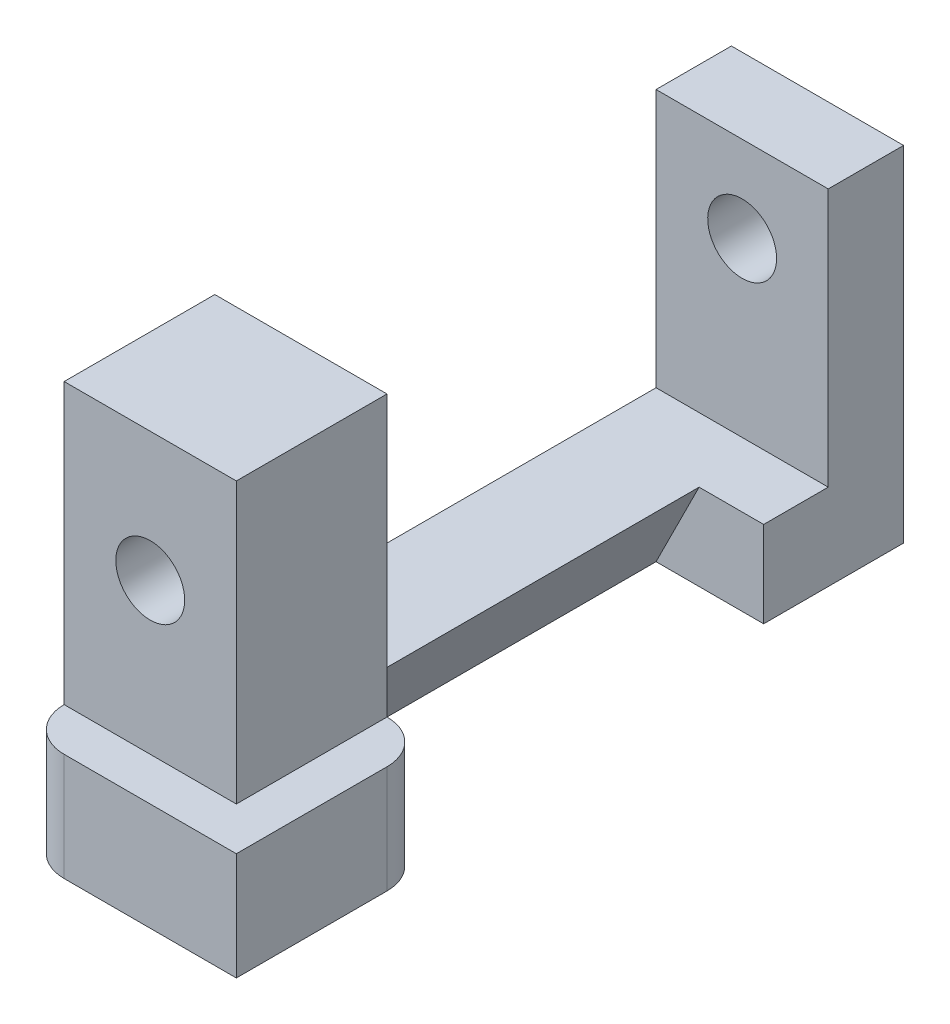
ISO-10303-21;
HEADER;
FILE_DESCRIPTION(('STEP AP214'),'2;1');
FILE_NAME('part.step','',(''),(''),'','','');
FILE_SCHEMA(('AUTOMOTIVE_DESIGN { 1 0 10303 214 1 1 1 1 }'));
ENDSEC;
DATA;
#1=APPLICATION_CONTEXT('core data for automotive mechanical design processes');
#2=APPLICATION_PROTOCOL_DEFINITION('international standard','automotive_design',2000,#1);
#3=PRODUCT_CONTEXT('',#1,'mechanical');
#4=PRODUCT('Part','Part','',(#3));
#5=PRODUCT_RELATED_PRODUCT_CATEGORY('part','',(#4));
#6=PRODUCT_DEFINITION_FORMATION('','',#4);
#7=PRODUCT_DEFINITION_CONTEXT('part definition',#1,'design');
#8=PRODUCT_DEFINITION('design','',#6,#7);
#9=PRODUCT_DEFINITION_SHAPE('','',#8);
#10=(LENGTH_UNIT() NAMED_UNIT(*) SI_UNIT(.MILLI.,.METRE.));
#11=(NAMED_UNIT(*) PLANE_ANGLE_UNIT() SI_UNIT($,.RADIAN.));
#12=(NAMED_UNIT(*) SI_UNIT($,.STERADIAN.) SOLID_ANGLE_UNIT());
#13=UNCERTAINTY_MEASURE_WITH_UNIT(LENGTH_MEASURE(1.E-05),#10,'distance_accuracy_value','');
#14=(GEOMETRIC_REPRESENTATION_CONTEXT(3) GLOBAL_UNCERTAINTY_ASSIGNED_CONTEXT((#13)) GLOBAL_UNIT_ASSIGNED_CONTEXT((#10,
#11,#12)) REPRESENTATION_CONTEXT('',''));
#15=CARTESIAN_POINT('',(0.,0.,0.));
#16=DIRECTION('',(0.,0.,1.));
#17=DIRECTION('',(1.,0.,0.));
#18=AXIS2_PLACEMENT_3D('',#15,#16,#17);
#19=CARTESIAN_POINT('',(-8.,18.,31.));
#20=DIRECTION('',(0.,0.,1.));
#21=DIRECTION('',(0.,-1.,0.));
#22=AXIS2_PLACEMENT_3D('',#19,#20,#21);
#23=PLANE('',#22);
#24=CARTESIAN_POINT('',(-12.,12.,31.));
#25=DIRECTION('',(0.,0.,1.));
#26=DIRECTION('',(1.,0.,0.));
#27=AXIS2_PLACEMENT_3D('',#24,#25,#26);
#28=CIRCLE('',#27,1.6);
#29=CARTESIAN_POINT('',(-10.4,12.,31.));
#30=VERTEX_POINT('',#29);
#31=EDGE_CURVE('E162',#30,#30,#28,.T.);
#32=ORIENTED_EDGE('',*,*,#31,.F.);
#33=EDGE_LOOP('',(#32));
#34=FACE_BOUND('',#33,.T.);
#35=DIRECTION('',(0.,-1.,0.));
#36=VECTOR('',#35,1.);
#37=CARTESIAN_POINT('',(-16.,18.,31.));
#38=LINE('',#37,#36);
#39=CARTESIAN_POINT('',(-16.,18.,31.));
#40=VERTEX_POINT('',#39);
#41=CARTESIAN_POINT('',(-16.,5.,31.));
#42=VERTEX_POINT('',#41);
#43=EDGE_CURVE('E255',#40,#42,#38,.T.);
#44=ORIENTED_EDGE('',*,*,#43,.T.);
#45=DIRECTION('',(1.,0.,0.));
#46=VECTOR('',#45,1.);
#47=CARTESIAN_POINT('',(-16.,5.,31.));
#48=LINE('',#47,#46);
#49=CARTESIAN_POINT('',(-8.,5.,31.));
#50=VERTEX_POINT('',#49);
#51=EDGE_CURVE('E183',#42,#50,#48,.T.);
#52=ORIENTED_EDGE('',*,*,#51,.T.);
#53=DIRECTION('',(0.,1.,0.));
#54=VECTOR('',#53,1.);
#55=CARTESIAN_POINT('',(-8.,18.,31.));
#56=LINE('',#55,#54);
#57=CARTESIAN_POINT('',(-8.,18.,31.));
#58=VERTEX_POINT('',#57);
#59=EDGE_CURVE('E245',#50,#58,#56,.T.);
#60=ORIENTED_EDGE('',*,*,#59,.T.);
#61=DIRECTION('',(1.,0.,0.));
#62=VECTOR('',#61,1.);
#63=CARTESIAN_POINT('',(-8.,18.,31.));
#64=LINE('',#63,#62);
#65=EDGE_CURVE('E52',#40,#58,#64,.T.);
#66=ORIENTED_EDGE('',*,*,#65,.F.);
#67=EDGE_LOOP('',(#44,#52,#60,#66));
#68=FACE_BOUND('',#67,.T.);
#69=ADVANCED_FACE('F44',(#34,#68),#23,.T.);
#70=CARTESIAN_POINT('',(-8.,0.,0.));
#71=DIRECTION('',(1.,0.,0.));
#72=DIRECTION('',(0.,0.,-1.));
#73=AXIS2_PLACEMENT_3D('',#70,#71,#72);
#74=PLANE('',#73);
#75=ORIENTED_EDGE('',*,*,#59,.F.);
#76=DIRECTION('',(0.,0.,-1.));
#77=VECTOR('',#76,1.);
#78=CARTESIAN_POINT('',(-8.,5.,31.));
#79=LINE('',#78,#77);
#80=CARTESIAN_POINT('',(-8.,5.,24.));
#81=VERTEX_POINT('',#80);
#82=EDGE_CURVE('E187',#50,#81,#79,.T.);
#83=ORIENTED_EDGE('',*,*,#82,.T.);
#84=DIRECTION('',(0.,-1.,0.));
#85=VECTOR('',#84,1.);
#86=CARTESIAN_POINT('',(-8.,4.,24.));
#87=LINE('',#86,#85);
#88=CARTESIAN_POINT('',(-8.,18.,24.));
#89=VERTEX_POINT('',#88);
#90=EDGE_CURVE('E239',#89,#81,#87,.T.);
#91=ORIENTED_EDGE('',*,*,#90,.F.);
#92=DIRECTION('',(0.,0.,-1.));
#93=VECTOR('',#92,1.);
#94=CARTESIAN_POINT('',(-8.,18.,24.));
#95=LINE('',#94,#93);
#96=EDGE_CURVE('E242',#58,#89,#95,.T.);
#97=ORIENTED_EDGE('',*,*,#96,.F.);
#98=EDGE_LOOP('',(#75,#83,#91,#97));
#99=FACE_BOUND('',#98,.T.);
#100=ADVANCED_FACE('F332',(#99),#74,.T.);
#101=CARTESIAN_POINT('',(-8.,16.,3.5));
#102=DIRECTION('',(0.,0.,1.));
#103=DIRECTION('',(0.,-1.,0.));
#104=AXIS2_PLACEMENT_3D('',#101,#102,#103);
#105=PLANE('',#104);
#106=CARTESIAN_POINT('',(-12.,12.,3.5));
#107=DIRECTION('',(0.,0.,1.));
#108=DIRECTION('',(0.,-1.,0.));
#109=AXIS2_PLACEMENT_3D('',#106,#107,#108);
#110=CIRCLE('',#109,1.6);
#111=CARTESIAN_POINT('',(-12.,10.4,3.5));
#112=VERTEX_POINT('',#111);
#113=EDGE_CURVE('E176',#112,#112,#110,.T.);
#114=ORIENTED_EDGE('',*,*,#113,.F.);
#115=EDGE_LOOP('',(#114));
#116=FACE_BOUND('',#115,.T.);
#117=DIRECTION('',(-1.,0.,0.));
#118=VECTOR('',#117,1.);
#119=CARTESIAN_POINT('',(-8.,4.,3.5));
#120=LINE('',#119,#118);
#121=CARTESIAN_POINT('',(-8.,4.,3.5));
#122=VERTEX_POINT('',#121);
#123=CARTESIAN_POINT('',(-16.,4.,3.5));
#124=VERTEX_POINT('',#123);
#125=EDGE_CURVE('E277',#122,#124,#120,.T.);
#126=ORIENTED_EDGE('',*,*,#125,.F.);
#127=DIRECTION('',(0.,1.,0.));
#128=VECTOR('',#127,1.);
#129=CARTESIAN_POINT('',(-8.,16.,3.5));
#130=LINE('',#129,#128);
#131=CARTESIAN_POINT('',(-8.,16.,3.5));
#132=VERTEX_POINT('',#131);
#133=EDGE_CURVE('E235',#122,#132,#130,.T.);
#134=ORIENTED_EDGE('',*,*,#133,.T.);
#135=DIRECTION('',(1.,0.,0.));
#136=VECTOR('',#135,1.);
#137=CARTESIAN_POINT('',(-8.,16.,3.5));
#138=LINE('',#137,#136);
#139=CARTESIAN_POINT('',(-16.,16.,3.5));
#140=VERTEX_POINT('',#139);
#141=EDGE_CURVE('E288',#140,#132,#138,.T.);
#142=ORIENTED_EDGE('',*,*,#141,.F.);
#143=DIRECTION('',(0.,-1.,0.));
#144=VECTOR('',#143,1.);
#145=CARTESIAN_POINT('',(-16.,16.,3.5));
#146=LINE('',#145,#144);
#147=EDGE_CURVE('E267',#140,#124,#146,.T.);
#148=ORIENTED_EDGE('',*,*,#147,.T.);
#149=EDGE_LOOP('',(#126,#134,#142,#148));
#150=FACE_BOUND('',#149,.T.);
#151=ADVANCED_FACE('F345',(#116,#150),#105,.T.);
#152=CARTESIAN_POINT('',(-13.,0.,30.4031242374328));
#153=DIRECTION('',(-0.894427190999916,0.447213595499958,0.));
#154=DIRECTION('',(-0.447213595499958,-0.894427190999916,0.));
#155=AXIS2_PLACEMENT_3D('',#152,#153,#154);
#156=PLANE('',#155);
#157=DIRECTION('',(-0.447213595499958,-0.894427190999916,0.));
#158=VECTOR('',#157,1.);
#159=CARTESIAN_POINT('',(-11.,4.,6.5));
#160=LINE('',#159,#158);
#161=CARTESIAN_POINT('',(-11.,4.,6.5));
#162=VERTEX_POINT('',#161);
#163=CARTESIAN_POINT('',(-13.,0.,6.5));
#164=VERTEX_POINT('',#163);
#165=EDGE_CURVE('E59',#162,#164,#160,.T.);
#166=ORIENTED_EDGE('',*,*,#165,.F.);
#167=DIRECTION('',(0.,0.,-1.));
#168=VECTOR('',#167,1.);
#169=CARTESIAN_POINT('',(-11.,4.,30.4031242374328));
#170=LINE('',#169,#168);
#171=CARTESIAN_POINT('',(-11.,4.,24.));
#172=VERTEX_POINT('',#171);
#173=EDGE_CURVE('E250',#172,#162,#170,.T.);
#174=ORIENTED_EDGE('',*,*,#173,.F.);
#175=DIRECTION('',(-0.447213595499958,-0.894427190999916,0.));
#176=VECTOR('',#175,1.);
#177=CARTESIAN_POINT('',(-13.,0.,24.));
#178=LINE('',#177,#176);
#179=CARTESIAN_POINT('',(-13.,0.,24.));
#180=VERTEX_POINT('',#179);
#181=EDGE_CURVE('E247',#172,#180,#178,.T.);
#182=ORIENTED_EDGE('',*,*,#181,.T.);
#183=DIRECTION('',(0.,0.,-1.));
#184=VECTOR('',#183,1.);
#185=CARTESIAN_POINT('',(-13.,0.,30.4031242374328));
#186=LINE('',#185,#184);
#187=EDGE_CURVE('E64',#180,#164,#186,.T.);
#188=ORIENTED_EDGE('',*,*,#187,.T.);
#189=EDGE_LOOP('',(#166,#174,#182,#188));
#190=FACE_BOUND('',#189,.T.);
#191=ADVANCED_FACE('F320',(#190),#156,.F.);
#192=CARTESIAN_POINT('',(-8.,0.,31.));
#193=DIRECTION('',(0.,-1.,0.));
#194=DIRECTION('',(0.,0.,-1.));
#195=AXIS2_PLACEMENT_3D('',#192,#193,#194);
#196=PLANE('',#195);
#197=CARTESIAN_POINT('',(-10.285,0.,29.));
#198=DIRECTION('',(0.,-1.,0.));
#199=DIRECTION('',(0.,0.,-1.));
#200=AXIS2_PLACEMENT_3D('',#197,#198,#199);
#201=CIRCLE('',#200,1.5);
#202=CARTESIAN_POINT('',(-10.285,0.,27.5));
#203=VERTEX_POINT('',#202);
#204=EDGE_CURVE('E163',#203,#203,#201,.T.);
#205=ORIENTED_EDGE('',*,*,#204,.F.);
#206=EDGE_LOOP('',(#205));
#207=FACE_BOUND('',#206,.T.);
#208=DIRECTION('',(0.,0.,1.));
#209=VECTOR('',#208,1.);
#210=CARTESIAN_POINT('',(-8.,0.,31.));
#211=LINE('',#210,#209);
#212=CARTESIAN_POINT('',(-8.,0.,0.));
#213=VERTEX_POINT('',#212);
#214=CARTESIAN_POINT('',(-8.,0.,6.5));
#215=VERTEX_POINT('',#214);
#216=EDGE_CURVE('E237',#213,#215,#211,.T.);
#217=ORIENTED_EDGE('',*,*,#216,.T.);
#218=DIRECTION('',(1.,0.,0.));
#219=VECTOR('',#218,1.);
#220=CARTESIAN_POINT('',(-13.,0.,6.5));
#221=LINE('',#220,#219);
#222=EDGE_CURVE('E224',#164,#215,#221,.T.);
#223=ORIENTED_EDGE('',*,*,#222,.F.);
#224=ORIENTED_EDGE('',*,*,#187,.F.);
#225=DIRECTION('',(-1.,0.,0.));
#226=VECTOR('',#225,1.);
#227=CARTESIAN_POINT('',(-8.,0.,24.));
#228=LINE('',#227,#226);
#229=CARTESIAN_POINT('',(-8.,0.,24.));
#230=VERTEX_POINT('',#229);
#231=EDGE_CURVE('E279',#230,#180,#228,.T.);
#232=ORIENTED_EDGE('',*,*,#231,.F.);
#233=CARTESIAN_POINT('',(-8.,0.,26.));
#234=DIRECTION('',(0.,-1.,0.));
#235=DIRECTION('',(0.,0.,1.));
#236=AXIS2_PLACEMENT_3D('',#233,#234,#235);
#237=CIRCLE('',#236,2.);
#238=CARTESIAN_POINT('',(-6.,0.,26.));
#239=VERTEX_POINT('',#238);
#240=EDGE_CURVE('E202',#230,#239,#237,.T.);
#241=ORIENTED_EDGE('',*,*,#240,.T.);
#242=DIRECTION('',(0.,0.,1.));
#243=VECTOR('',#242,1.);
#244=CARTESIAN_POINT('',(-6.,0.,33.));
#245=LINE('',#244,#243);
#246=CARTESIAN_POINT('',(-6.,0.,33.));
#247=VERTEX_POINT('',#246);
#248=EDGE_CURVE('E205',#239,#247,#245,.T.);
#249=ORIENTED_EDGE('',*,*,#248,.T.);
#250=DIRECTION('',(-1.,0.,0.));
#251=VECTOR('',#250,1.);
#252=CARTESIAN_POINT('',(-14.,0.,33.));
#253=LINE('',#252,#251);
#254=CARTESIAN_POINT('',(-14.,0.,33.));
#255=VERTEX_POINT('',#254);
#256=EDGE_CURVE('E184',#247,#255,#253,.T.);
#257=ORIENTED_EDGE('',*,*,#256,.T.);
#258=CARTESIAN_POINT('',(-14.,0.,31.));
#259=DIRECTION('',(0.,-1.,0.));
#260=DIRECTION('',(0.,0.,-1.));
#261=AXIS2_PLACEMENT_3D('',#258,#259,#260);
#262=CIRCLE('',#261,2.);
#263=CARTESIAN_POINT('',(-16.,0.,31.));
#264=VERTEX_POINT('',#263);
#265=EDGE_CURVE('E179',#255,#264,#262,.T.);
#266=ORIENTED_EDGE('',*,*,#265,.T.);
#267=DIRECTION('',(0.,0.,-1.));
#268=VECTOR('',#267,1.);
#269=CARTESIAN_POINT('',(-16.,0.,31.));
#270=LINE('',#269,#268);
#271=CARTESIAN_POINT('',(-16.,0.,0.));
#272=VERTEX_POINT('',#271);
#273=EDGE_CURVE('E249',#264,#272,#270,.T.);
#274=ORIENTED_EDGE('',*,*,#273,.T.);
#275=DIRECTION('',(1.,0.,0.));
#276=VECTOR('',#275,1.);
#277=CARTESIAN_POINT('',(-8.,0.,0.));
#278=LINE('',#277,#276);
#279=EDGE_CURVE('E282',#272,#213,#278,.T.);
#280=ORIENTED_EDGE('',*,*,#279,.T.);
#281=EDGE_LOOP('',(#217,#223,#224,#232,#241,#249,#257,#266,#274,#280));
#282=FACE_BOUND('',#281,.T.);
#283=ADVANCED_FACE('F46',(#207,#282),#196,.T.);
#284=CARTESIAN_POINT('',(-8.,18.,24.));
#285=DIRECTION('',(0.,1.,0.));
#286=DIRECTION('',(0.,0.,1.));
#287=AXIS2_PLACEMENT_3D('',#284,#285,#286);
#288=PLANE('',#287);
#289=ORIENTED_EDGE('',*,*,#65,.T.);
#290=ORIENTED_EDGE('',*,*,#96,.T.);
#291=DIRECTION('',(1.,0.,0.));
#292=VECTOR('',#291,1.);
#293=CARTESIAN_POINT('',(-8.,18.,24.));
#294=LINE('',#293,#292);
#295=CARTESIAN_POINT('',(-16.,18.,24.));
#296=VERTEX_POINT('',#295);
#297=EDGE_CURVE('E285',#296,#89,#294,.T.);
#298=ORIENTED_EDGE('',*,*,#297,.F.);
#299=DIRECTION('',(0.,0.,1.));
#300=VECTOR('',#299,1.);
#301=CARTESIAN_POINT('',(-16.,18.,24.));
#302=LINE('',#301,#300);
#303=EDGE_CURVE('E258',#296,#40,#302,.T.);
#304=ORIENTED_EDGE('',*,*,#303,.T.);
#305=EDGE_LOOP('',(#289,#290,#298,#304));
#306=FACE_BOUND('',#305,.T.);
#307=ADVANCED_FACE('F328',(#306),#288,.T.);
#308=CARTESIAN_POINT('',(-8.,4.,24.));
#309=DIRECTION('',(0.,0.,-1.));
#310=DIRECTION('',(-1.,0.,0.));
#311=AXIS2_PLACEMENT_3D('',#308,#309,#310);
#312=PLANE('',#311);
#313=CARTESIAN_POINT('',(-12.,12.,24.));
#314=DIRECTION('',(0.,0.,-1.));
#315=DIRECTION('',(-1.,0.,0.));
#316=AXIS2_PLACEMENT_3D('',#313,#314,#315);
#317=CIRCLE('',#316,1.6);
#318=CARTESIAN_POINT('',(-13.6,12.,24.));
#319=VERTEX_POINT('',#318);
#320=EDGE_CURVE('E172',#319,#319,#317,.T.);
#321=ORIENTED_EDGE('',*,*,#320,.F.);
#322=EDGE_LOOP('',(#321));
#323=FACE_BOUND('',#322,.T.);
#324=ORIENTED_EDGE('',*,*,#297,.T.);
#325=ORIENTED_EDGE('',*,*,#90,.T.);
#326=DIRECTION('',(0.,-1.,0.));
#327=VECTOR('',#326,1.);
#328=CARTESIAN_POINT('',(-8.,5.,24.));
#329=LINE('',#328,#327);
#330=EDGE_CURVE('E217',#81,#230,#329,.T.);
#331=ORIENTED_EDGE('',*,*,#330,.T.);
#332=ORIENTED_EDGE('',*,*,#231,.T.);
#333=ORIENTED_EDGE('',*,*,#181,.F.);
#334=DIRECTION('',(-1.,0.,0.));
#335=VECTOR('',#334,1.);
#336=CARTESIAN_POINT('',(-8.,4.,24.));
#337=LINE('',#336,#335);
#338=CARTESIAN_POINT('',(-16.,4.,24.));
#339=VERTEX_POINT('',#338);
#340=EDGE_CURVE('E276',#172,#339,#337,.T.);
#341=ORIENTED_EDGE('',*,*,#340,.T.);
#342=DIRECTION('',(0.,1.,0.));
#343=VECTOR('',#342,1.);
#344=CARTESIAN_POINT('',(-16.,4.,24.));
#345=LINE('',#344,#343);
#346=EDGE_CURVE('E261',#339,#296,#345,.T.);
#347=ORIENTED_EDGE('',*,*,#346,.T.);
#348=EDGE_LOOP('',(#324,#325,#331,#332,#333,#341,#347));
#349=FACE_BOUND('',#348,.T.);
#350=ADVANCED_FACE('F319',(#323,#349),#312,.T.);
#351=CARTESIAN_POINT('',(-8.,16.,0.));
#352=DIRECTION('',(0.,1.,0.));
#353=DIRECTION('',(0.,0.,1.));
#354=AXIS2_PLACEMENT_3D('',#351,#352,#353);
#355=PLANE('',#354);
#356=ORIENTED_EDGE('',*,*,#141,.T.);
#357=DIRECTION('',(0.,0.,-1.));
#358=VECTOR('',#357,1.);
#359=CARTESIAN_POINT('',(-8.,16.,0.));
#360=LINE('',#359,#358);
#361=CARTESIAN_POINT('',(-8.,16.,0.));
#362=VERTEX_POINT('',#361);
#363=EDGE_CURVE('E232',#132,#362,#360,.T.);
#364=ORIENTED_EDGE('',*,*,#363,.T.);
#365=DIRECTION('',(1.,0.,0.));
#366=VECTOR('',#365,1.);
#367=CARTESIAN_POINT('',(-8.,16.,0.));
#368=LINE('',#367,#366);
#369=CARTESIAN_POINT('',(-16.,16.,0.));
#370=VERTEX_POINT('',#369);
#371=EDGE_CURVE('E291',#370,#362,#368,.T.);
#372=ORIENTED_EDGE('',*,*,#371,.F.);
#373=DIRECTION('',(0.,0.,1.));
#374=VECTOR('',#373,1.);
#375=CARTESIAN_POINT('',(-16.,16.,0.));
#376=LINE('',#375,#374);
#377=EDGE_CURVE('E270',#370,#140,#376,.T.);
#378=ORIENTED_EDGE('',*,*,#377,.T.);
#379=EDGE_LOOP('',(#356,#364,#372,#378));
#380=FACE_BOUND('',#379,.T.);
#381=ADVANCED_FACE('F307',(#380),#355,.T.);
#382=CARTESIAN_POINT('',(-8.,0.,0.));
#383=DIRECTION('',(0.,0.,-1.));
#384=DIRECTION('',(-1.,0.,0.));
#385=AXIS2_PLACEMENT_3D('',#382,#383,#384);
#386=PLANE('',#385);
#387=CARTESIAN_POINT('',(-12.,12.,0.));
#388=DIRECTION('',(0.,0.,1.));
#389=DIRECTION('',(1.,0.,0.));
#390=AXIS2_PLACEMENT_3D('',#387,#388,#389);
#391=CIRCLE('',#390,1.6);
#392=CARTESIAN_POINT('',(-10.4,12.,0.));
#393=VERTEX_POINT('',#392);
#394=EDGE_CURVE('E166',#393,#393,#391,.T.);
#395=ORIENTED_EDGE('',*,*,#394,.T.);
#396=EDGE_LOOP('',(#395));
#397=FACE_BOUND('',#396,.T.);
#398=ORIENTED_EDGE('',*,*,#371,.T.);
#399=DIRECTION('',(0.,-1.,0.));
#400=VECTOR('',#399,1.);
#401=CARTESIAN_POINT('',(-8.,0.,0.));
#402=LINE('',#401,#400);
#403=EDGE_CURVE('E13',#362,#213,#402,.T.);
#404=ORIENTED_EDGE('',*,*,#403,.T.);
#405=ORIENTED_EDGE('',*,*,#279,.F.);
#406=DIRECTION('',(0.,1.,0.));
#407=VECTOR('',#406,1.);
#408=CARTESIAN_POINT('',(-16.,0.,0.));
#409=LINE('',#408,#407);
#410=EDGE_CURVE('E273',#272,#370,#409,.T.);
#411=ORIENTED_EDGE('',*,*,#410,.T.);
#412=EDGE_LOOP('',(#398,#404,#405,#411));
#413=FACE_BOUND('',#412,.T.);
#414=ADVANCED_FACE('F299',(#397,#413),#386,.T.);
#415=CARTESIAN_POINT('',(-8.,4.,3.5));
#416=DIRECTION('',(0.,-1.,0.));
#417=DIRECTION('',(0.,0.,-1.));
#418=AXIS2_PLACEMENT_3D('',#415,#416,#417);
#419=PLANE('',#418);
#420=ORIENTED_EDGE('',*,*,#340,.F.);
#421=ORIENTED_EDGE('',*,*,#173,.T.);
#422=DIRECTION('',(-1.,0.,0.));
#423=VECTOR('',#422,1.);
#424=CARTESIAN_POINT('',(-8.,4.,6.5));
#425=LINE('',#424,#423);
#426=CARTESIAN_POINT('',(-8.,4.,6.5));
#427=VERTEX_POINT('',#426);
#428=EDGE_CURVE('E212',#427,#162,#425,.T.);
#429=ORIENTED_EDGE('',*,*,#428,.F.);
#430=DIRECTION('',(0.,0.,-1.));
#431=VECTOR('',#430,1.);
#432=CARTESIAN_POINT('',(-8.,4.,6.5));
#433=LINE('',#432,#431);
#434=EDGE_CURVE('E229',#427,#122,#433,.T.);
#435=ORIENTED_EDGE('',*,*,#434,.T.);
#436=ORIENTED_EDGE('',*,*,#125,.T.);
#437=DIRECTION('',(0.,0.,1.));
#438=VECTOR('',#437,1.);
#439=CARTESIAN_POINT('',(-16.,4.,3.5));
#440=LINE('',#439,#438);
#441=EDGE_CURVE('E264',#124,#339,#440,.T.);
#442=ORIENTED_EDGE('',*,*,#441,.T.);
#443=EDGE_LOOP('',(#420,#421,#429,#435,#436,#442));
#444=FACE_BOUND('',#443,.T.);
#445=ADVANCED_FACE('F323',(#444),#419,.F.);
#446=CARTESIAN_POINT('',(-16.,0.,0.));
#447=DIRECTION('',(-1.,0.,0.));
#448=DIRECTION('',(0.,0.,-1.));
#449=AXIS2_PLACEMENT_3D('',#446,#447,#448);
#450=PLANE('',#449);
#451=ORIENTED_EDGE('',*,*,#273,.F.);
#452=DIRECTION('',(0.,-1.,0.));
#453=VECTOR('',#452,1.);
#454=CARTESIAN_POINT('',(-16.,5.,31.));
#455=LINE('',#454,#453);
#456=EDGE_CURVE('E199',#42,#264,#455,.T.);
#457=ORIENTED_EDGE('',*,*,#456,.F.);
#458=ORIENTED_EDGE('',*,*,#43,.F.);
#459=ORIENTED_EDGE('',*,*,#303,.F.);
#460=ORIENTED_EDGE('',*,*,#346,.F.);
#461=ORIENTED_EDGE('',*,*,#441,.F.);
#462=ORIENTED_EDGE('',*,*,#147,.F.);
#463=ORIENTED_EDGE('',*,*,#377,.F.);
#464=ORIENTED_EDGE('',*,*,#410,.F.);
#465=EDGE_LOOP('',(#451,#457,#458,#459,#460,#461,#462,#463,#464));
#466=FACE_BOUND('',#465,.T.);
#467=ADVANCED_FACE('F302',(#466),#450,.T.);
#468=ORIENTED_EDGE('',*,*,#403,.F.);
#469=ORIENTED_EDGE('',*,*,#363,.F.);
#470=ORIENTED_EDGE('',*,*,#133,.F.);
#471=ORIENTED_EDGE('',*,*,#434,.F.);
#472=DIRECTION('',(0.,1.,0.));
#473=VECTOR('',#472,1.);
#474=CARTESIAN_POINT('',(-8.,0.,6.5));
#475=LINE('',#474,#473);
#476=EDGE_CURVE('E227',#215,#427,#475,.T.);
#477=ORIENTED_EDGE('',*,*,#476,.F.);
#478=ORIENTED_EDGE('',*,*,#216,.F.);
#479=EDGE_LOOP('',(#468,#469,#470,#471,#477,#478));
#480=FACE_BOUND('',#479,.T.);
#481=ADVANCED_FACE('F311',(#480),#74,.T.);
#482=CARTESIAN_POINT('',(0.,0.,6.5));
#483=DIRECTION('',(0.,0.,-1.));
#484=DIRECTION('',(-1.,0.,0.));
#485=AXIS2_PLACEMENT_3D('',#482,#483,#484);
#486=PLANE('',#485);
#487=ORIENTED_EDGE('',*,*,#428,.T.);
#488=ORIENTED_EDGE('',*,*,#165,.T.);
#489=ORIENTED_EDGE('',*,*,#222,.T.);
#490=ORIENTED_EDGE('',*,*,#476,.T.);
#491=EDGE_LOOP('',(#487,#488,#489,#490));
#492=FACE_BOUND('',#491,.T.);
#493=ADVANCED_FACE('F316',(#492),#486,.F.);
#494=CARTESIAN_POINT('',(-14.,5.,31.));
#495=DIRECTION('',(0.,-1.,0.));
#496=DIRECTION('',(0.,0.,-1.));
#497=AXIS2_PLACEMENT_3D('',#494,#495,#496);
#498=CYLINDRICAL_SURFACE('',#497,2.);
#499=ORIENTED_EDGE('',*,*,#265,.F.);
#500=DIRECTION('',(0.,-1.,0.));
#501=VECTOR('',#500,1.);
#502=CARTESIAN_POINT('',(-14.,5.,33.));
#503=LINE('',#502,#501);
#504=CARTESIAN_POINT('',(-14.,5.,33.));
#505=VERTEX_POINT('',#504);
#506=EDGE_CURVE('E210',#505,#255,#503,.T.);
#507=ORIENTED_EDGE('',*,*,#506,.F.);
#508=CARTESIAN_POINT('',(-14.,5.,31.));
#509=DIRECTION('',(0.,-1.,0.));
#510=DIRECTION('',(0.,0.,-1.));
#511=AXIS2_PLACEMENT_3D('',#508,#509,#510);
#512=CIRCLE('',#511,2.);
#513=EDGE_CURVE('E180',#505,#42,#512,.T.);
#514=ORIENTED_EDGE('',*,*,#513,.T.);
#515=ORIENTED_EDGE('',*,*,#456,.T.);
#516=EDGE_LOOP('',(#499,#507,#514,#515));
#517=FACE_BOUND('',#516,.T.);
#518=ADVANCED_FACE('F384',(#517),#498,.T.);
#519=CARTESIAN_POINT('',(-14.,5.,33.));
#520=DIRECTION('',(0.,0.,1.));
#521=DIRECTION('',(1.,0.,0.));
#522=AXIS2_PLACEMENT_3D('',#519,#520,#521);
#523=PLANE('',#522);
#524=ORIENTED_EDGE('',*,*,#256,.F.);
#525=DIRECTION('',(0.,-1.,0.));
#526=VECTOR('',#525,1.);
#527=CARTESIAN_POINT('',(-6.,5.,33.));
#528=LINE('',#527,#526);
#529=CARTESIAN_POINT('',(-6.,5.,33.));
#530=VERTEX_POINT('',#529);
#531=EDGE_CURVE('E213',#530,#247,#528,.T.);
#532=ORIENTED_EDGE('',*,*,#531,.F.);
#533=DIRECTION('',(-1.,0.,0.));
#534=VECTOR('',#533,1.);
#535=CARTESIAN_POINT('',(-14.,5.,33.));
#536=LINE('',#535,#534);
#537=EDGE_CURVE('E196',#530,#505,#536,.T.);
#538=ORIENTED_EDGE('',*,*,#537,.T.);
#539=ORIENTED_EDGE('',*,*,#506,.T.);
#540=EDGE_LOOP('',(#524,#532,#538,#539));
#541=FACE_BOUND('',#540,.T.);
#542=ADVANCED_FACE('F380',(#541),#523,.T.);
#543=CARTESIAN_POINT('',(-6.,5.,33.));
#544=DIRECTION('',(1.,0.,0.));
#545=DIRECTION('',(0.,0.,-1.));
#546=AXIS2_PLACEMENT_3D('',#543,#544,#545);
#547=PLANE('',#546);
#548=ORIENTED_EDGE('',*,*,#248,.F.);
#549=DIRECTION('',(0.,-1.,0.));
#550=VECTOR('',#549,1.);
#551=CARTESIAN_POINT('',(-6.,5.,26.));
#552=LINE('',#551,#550);
#553=CARTESIAN_POINT('',(-6.,5.,26.));
#554=VERTEX_POINT('',#553);
#555=EDGE_CURVE('E215',#554,#239,#552,.T.);
#556=ORIENTED_EDGE('',*,*,#555,.F.);
#557=DIRECTION('',(0.,0.,1.));
#558=VECTOR('',#557,1.);
#559=CARTESIAN_POINT('',(-6.,5.,33.));
#560=LINE('',#559,#558);
#561=EDGE_CURVE('E193',#554,#530,#560,.T.);
#562=ORIENTED_EDGE('',*,*,#561,.T.);
#563=ORIENTED_EDGE('',*,*,#531,.T.);
#564=EDGE_LOOP('',(#548,#556,#562,#563));
#565=FACE_BOUND('',#564,.T.);
#566=ADVANCED_FACE('F383',(#565),#547,.T.);
#567=CARTESIAN_POINT('',(-8.,5.,26.));
#568=DIRECTION('',(0.,-1.,0.));
#569=DIRECTION('',(0.,0.,-1.));
#570=AXIS2_PLACEMENT_3D('',#567,#568,#569);
#571=CYLINDRICAL_SURFACE('',#570,2.);
#572=ORIENTED_EDGE('',*,*,#240,.F.);
#573=ORIENTED_EDGE('',*,*,#330,.F.);
#574=CARTESIAN_POINT('',(-8.,5.,26.));
#575=DIRECTION('',(0.,-1.,0.));
#576=DIRECTION('',(0.,0.,1.));
#577=AXIS2_PLACEMENT_3D('',#574,#575,#576);
#578=CIRCLE('',#577,2.);
#579=EDGE_CURVE('E190',#81,#554,#578,.T.);
#580=ORIENTED_EDGE('',*,*,#579,.T.);
#581=ORIENTED_EDGE('',*,*,#555,.T.);
#582=EDGE_LOOP('',(#572,#573,#580,#581));
#583=FACE_BOUND('',#582,.T.);
#584=ADVANCED_FACE('F376',(#583),#571,.T.);
#585=CARTESIAN_POINT('',(-14.,5.,31.));
#586=DIRECTION('',(0.,-1.,0.));
#587=DIRECTION('',(0.,0.,-1.));
#588=AXIS2_PLACEMENT_3D('',#585,#586,#587);
#589=PLANE('',#588);
#590=ORIENTED_EDGE('',*,*,#513,.F.);
#591=ORIENTED_EDGE('',*,*,#537,.F.);
#592=ORIENTED_EDGE('',*,*,#561,.F.);
#593=ORIENTED_EDGE('',*,*,#579,.F.);
#594=ORIENTED_EDGE('',*,*,#82,.F.);
#595=ORIENTED_EDGE('',*,*,#51,.F.);
#596=EDGE_LOOP('',(#590,#591,#592,#593,#594,#595));
#597=FACE_BOUND('',#596,.T.);
#598=ADVANCED_FACE('F336',(#597),#589,.F.);
#599=CARTESIAN_POINT('',(-12.,12.,0.));
#600=DIRECTION('',(0.,0.,1.));
#601=DIRECTION('',(1.,0.,0.));
#602=AXIS2_PLACEMENT_3D('',#599,#600,#601);
#603=CYLINDRICAL_SURFACE('',#602,1.6);
#604=ORIENTED_EDGE('',*,*,#113,.T.);
#605=EDGE_LOOP('',(#604));
#606=FACE_BOUND('',#605,.T.);
#607=ORIENTED_EDGE('',*,*,#394,.F.);
#608=EDGE_LOOP('',(#607));
#609=FACE_BOUND('',#608,.T.);
#610=ADVANCED_FACE('F367',(#606,#609),#603,.F.);
#611=ORIENTED_EDGE('',*,*,#320,.T.);
#612=EDGE_LOOP('',(#611));
#613=FACE_BOUND('',#612,.T.);
#614=ORIENTED_EDGE('',*,*,#31,.T.);
#615=EDGE_LOOP('',(#614));
#616=FACE_BOUND('',#615,.T.);
#617=ADVANCED_FACE('F156',(#613,#616),#603,.F.);
#618=CARTESIAN_POINT('',(-10.285,5.,29.));
#619=DIRECTION('',(0.,-1.,0.));
#620=DIRECTION('',(0.,0.,-1.));
#621=AXIS2_PLACEMENT_3D('',#618,#619,#620);
#622=CONICAL_SURFACE('',#621,1.5,1.02974425867665);
#623=CARTESIAN_POINT('',(-10.285,5.90129092854134,29.));
#624=VERTEX_POINT('',#623);
#625=VERTEX_LOOP('',#624);
#626=FACE_BOUND('',#625,.T.);
#627=CARTESIAN_POINT('',(-10.285,5.,29.));
#628=DIRECTION('',(0.,-1.,0.));
#629=DIRECTION('',(0.,0.,-1.));
#630=AXIS2_PLACEMENT_3D('',#627,#628,#629);
#631=CIRCLE('',#630,1.5);
#632=CARTESIAN_POINT('',(-10.285,5.,27.5));
#633=VERTEX_POINT('',#632);
#634=EDGE_CURVE('E160',#633,#633,#631,.T.);
#635=ORIENTED_EDGE('',*,*,#634,.T.);
#636=EDGE_LOOP('',(#635));
#637=FACE_BOUND('',#636,.T.);
#638=ADVANCED_FACE('F152',(#626,#637),#622,.F.);
#639=CARTESIAN_POINT('',(-10.285,0.,29.));
#640=DIRECTION('',(0.,-1.,0.));
#641=DIRECTION('',(0.,0.,-1.));
#642=AXIS2_PLACEMENT_3D('',#639,#640,#641);
#643=CYLINDRICAL_SURFACE('',#642,1.5);
#644=ORIENTED_EDGE('',*,*,#634,.F.);
#645=EDGE_LOOP('',(#644));
#646=FACE_BOUND('',#645,.T.);
#647=ORIENTED_EDGE('',*,*,#204,.T.);
#648=EDGE_LOOP('',(#647));
#649=FACE_BOUND('',#648,.T.);
#650=ADVANCED_FACE('F155',(#646,#649),#643,.F.);
#651=CLOSED_SHELL('',(#69,#100,#151,#191,#283,#307,#350,#381,#414,#445,#467,#481,#493,#518,#542,
#566,#584,#598,#610,#617,#638,#650));
#652=MANIFOLD_SOLID_BREP('B2',#651);
#653=ADVANCED_BREP_SHAPE_REPRESENTATION('',(#18,#652),#14);
#654=SHAPE_DEFINITION_REPRESENTATION(#9,#653);
ENDSEC;
END-ISO-10303-21;
